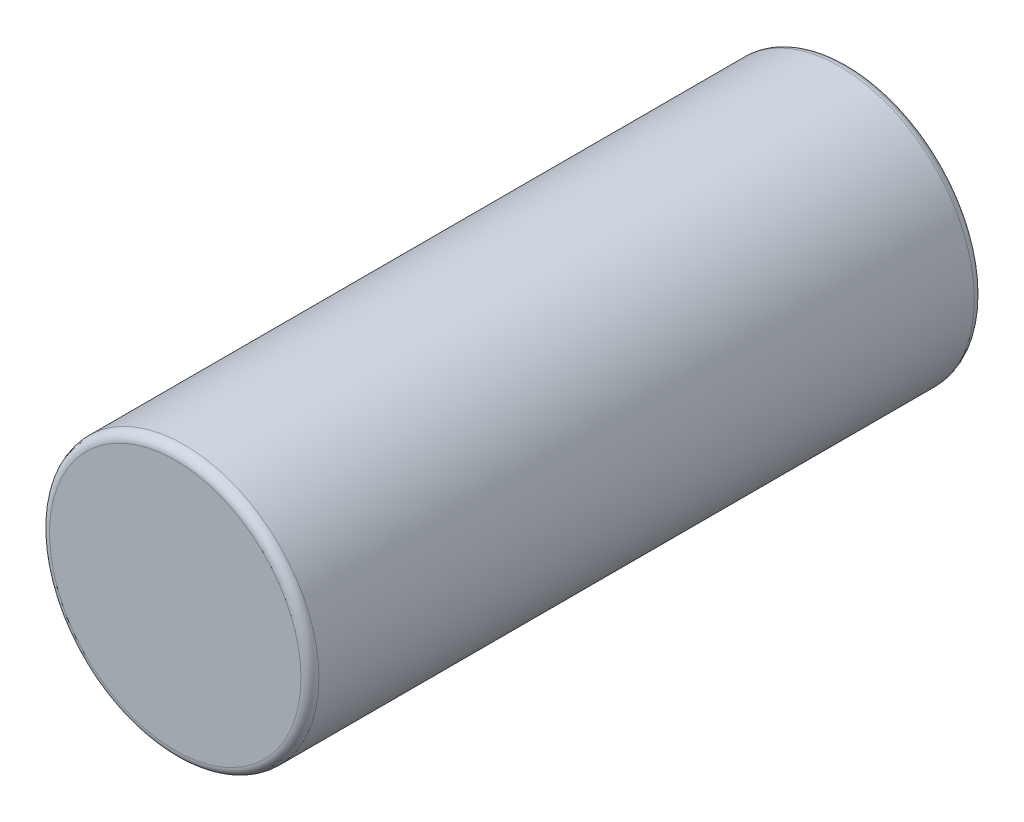
ISO-10303-21;
HEADER;
FILE_DESCRIPTION(('STEP AP214'),'2;1');
FILE_NAME('part.step','',(''),(''),'','','');
FILE_SCHEMA(('AUTOMOTIVE_DESIGN { 1 0 10303 214 1 1 1 1 }'));
ENDSEC;
DATA;
#1=APPLICATION_CONTEXT('core data for automotive mechanical design processes');
#2=APPLICATION_PROTOCOL_DEFINITION('international standard','automotive_design',2000,#1);
#3=PRODUCT_CONTEXT('',#1,'mechanical');
#4=PRODUCT('Part','Part','',(#3));
#5=PRODUCT_RELATED_PRODUCT_CATEGORY('part','',(#4));
#6=PRODUCT_DEFINITION_FORMATION('','',#4);
#7=PRODUCT_DEFINITION_CONTEXT('part definition',#1,'design');
#8=PRODUCT_DEFINITION('design','',#6,#7);
#9=PRODUCT_DEFINITION_SHAPE('','',#8);
#10=(LENGTH_UNIT() NAMED_UNIT(*) SI_UNIT(.MILLI.,.METRE.));
#11=(NAMED_UNIT(*) PLANE_ANGLE_UNIT() SI_UNIT($,.RADIAN.));
#12=(NAMED_UNIT(*) SI_UNIT($,.STERADIAN.) SOLID_ANGLE_UNIT());
#13=UNCERTAINTY_MEASURE_WITH_UNIT(LENGTH_MEASURE(1.E-05),#10,'distance_accuracy_value','');
#14=(GEOMETRIC_REPRESENTATION_CONTEXT(3) GLOBAL_UNCERTAINTY_ASSIGNED_CONTEXT((#13)) GLOBAL_UNIT_ASSIGNED_CONTEXT((#10,
#11,#12)) REPRESENTATION_CONTEXT('',''));
#15=CARTESIAN_POINT('',(0.,0.,0.));
#16=DIRECTION('',(0.,0.,1.));
#17=DIRECTION('',(1.,0.,0.));
#18=AXIS2_PLACEMENT_3D('',#15,#16,#17);
#19=CARTESIAN_POINT('',(0.,0.,15.));
#20=DIRECTION('',(0.,0.,-1.));
#21=DIRECTION('',(-1.,0.,0.));
#22=AXIS2_PLACEMENT_3D('',#19,#20,#21);
#23=CYLINDRICAL_SURFACE('',#22,3.);
#24=CARTESIAN_POINT('',(0.,0.,0.200000000000001));
#25=DIRECTION('',(0.,0.,1.));
#26=DIRECTION('',(1.,0.,0.));
#27=AXIS2_PLACEMENT_3D('',#24,#25,#26);
#28=CIRCLE('',#27,3.);
#29=CARTESIAN_POINT('',(3.,0.,0.200000000000001));
#30=VERTEX_POINT('',#29);
#31=EDGE_CURVE('E50',#30,#30,#28,.T.);
#32=ORIENTED_EDGE('',*,*,#31,.T.);
#33=EDGE_LOOP('',(#32));
#34=FACE_BOUND('',#33,.T.);
#35=CARTESIAN_POINT('',(0.,0.,14.8));
#36=DIRECTION('',(0.,0.,1.));
#37=DIRECTION('',(1.,0.,0.));
#38=AXIS2_PLACEMENT_3D('',#35,#36,#37);
#39=CIRCLE('',#38,3.);
#40=CARTESIAN_POINT('',(3.,0.,14.8));
#41=VERTEX_POINT('',#40);
#42=EDGE_CURVE('E55',#41,#41,#39,.F.);
#43=ORIENTED_EDGE('',*,*,#42,.T.);
#44=EDGE_LOOP('',(#43));
#45=FACE_BOUND('',#44,.T.);
#46=ADVANCED_FACE('F37',(#34,#45),#23,.T.);
#47=CARTESIAN_POINT('',(0.,0.,15.));
#48=DIRECTION('',(0.,0.,1.));
#49=DIRECTION('',(1.,0.,0.));
#50=AXIS2_PLACEMENT_3D('',#47,#48,#49);
#51=PLANE('',#50);
#52=CARTESIAN_POINT('',(0.,0.,15.));
#53=DIRECTION('',(0.,0.,1.));
#54=DIRECTION('',(1.,0.,0.));
#55=AXIS2_PLACEMENT_3D('',#52,#53,#54);
#56=CIRCLE('',#55,2.8);
#57=CARTESIAN_POINT('',(2.8,0.,15.));
#58=VERTEX_POINT('',#57);
#59=EDGE_CURVE('E10',#58,#58,#56,.T.);
#60=ORIENTED_EDGE('',*,*,#59,.T.);
#61=EDGE_LOOP('',(#60));
#62=FACE_BOUND('',#61,.T.);
#63=ADVANCED_FACE('F72',(#62),#51,.T.);
#64=CARTESIAN_POINT('',(0.,0.,0.));
#65=DIRECTION('',(0.,0.,1.));
#66=DIRECTION('',(1.,0.,0.));
#67=AXIS2_PLACEMENT_3D('',#64,#65,#66);
#68=PLANE('',#67);
#69=CARTESIAN_POINT('',(0.,0.,0.));
#70=DIRECTION('',(0.,0.,1.));
#71=DIRECTION('',(1.,0.,0.));
#72=AXIS2_PLACEMENT_3D('',#69,#70,#71);
#73=CIRCLE('',#72,2.8);
#74=CARTESIAN_POINT('',(2.8,0.,0.));
#75=VERTEX_POINT('',#74);
#76=EDGE_CURVE('E45',#75,#75,#73,.F.);
#77=ORIENTED_EDGE('',*,*,#76,.T.);
#78=EDGE_LOOP('',(#77));
#79=FACE_BOUND('',#78,.T.);
#80=ADVANCED_FACE('F69',(#79),#68,.F.);
#81=CARTESIAN_POINT('',(0.,0.,0.200000000000001));
#82=DIRECTION('',(0.,0.,1.));
#83=DIRECTION('',(1.,0.,0.));
#84=AXIS2_PLACEMENT_3D('',#81,#82,#83);
#85=TOROIDAL_SURFACE('',#84,2.8,0.2);
#86=ORIENTED_EDGE('',*,*,#76,.F.);
#87=EDGE_LOOP('',(#86));
#88=FACE_BOUND('',#87,.T.);
#89=ORIENTED_EDGE('',*,*,#31,.F.);
#90=EDGE_LOOP('',(#89));
#91=FACE_BOUND('',#90,.T.);
#92=ADVANCED_FACE('F65',(#88,#91),#85,.T.);
#93=CARTESIAN_POINT('',(0.,0.,14.8));
#94=DIRECTION('',(0.,0.,1.));
#95=DIRECTION('',(1.,0.,0.));
#96=AXIS2_PLACEMENT_3D('',#93,#94,#95);
#97=TOROIDAL_SURFACE('',#96,2.8,0.2);
#98=ORIENTED_EDGE('',*,*,#42,.F.);
#99=EDGE_LOOP('',(#98));
#100=FACE_BOUND('',#99,.T.);
#101=ORIENTED_EDGE('',*,*,#59,.F.);
#102=EDGE_LOOP('',(#101));
#103=FACE_BOUND('',#102,.T.);
#104=ADVANCED_FACE('F39',(#100,#103),#97,.T.);
#105=CLOSED_SHELL('',(#46,#63,#80,#92,#104));
#106=MANIFOLD_SOLID_BREP('B2',#105);
#107=ADVANCED_BREP_SHAPE_REPRESENTATION('',(#18,#106),#14);
#108=SHAPE_DEFINITION_REPRESENTATION(#9,#107);
ENDSEC;
END-ISO-10303-21;
